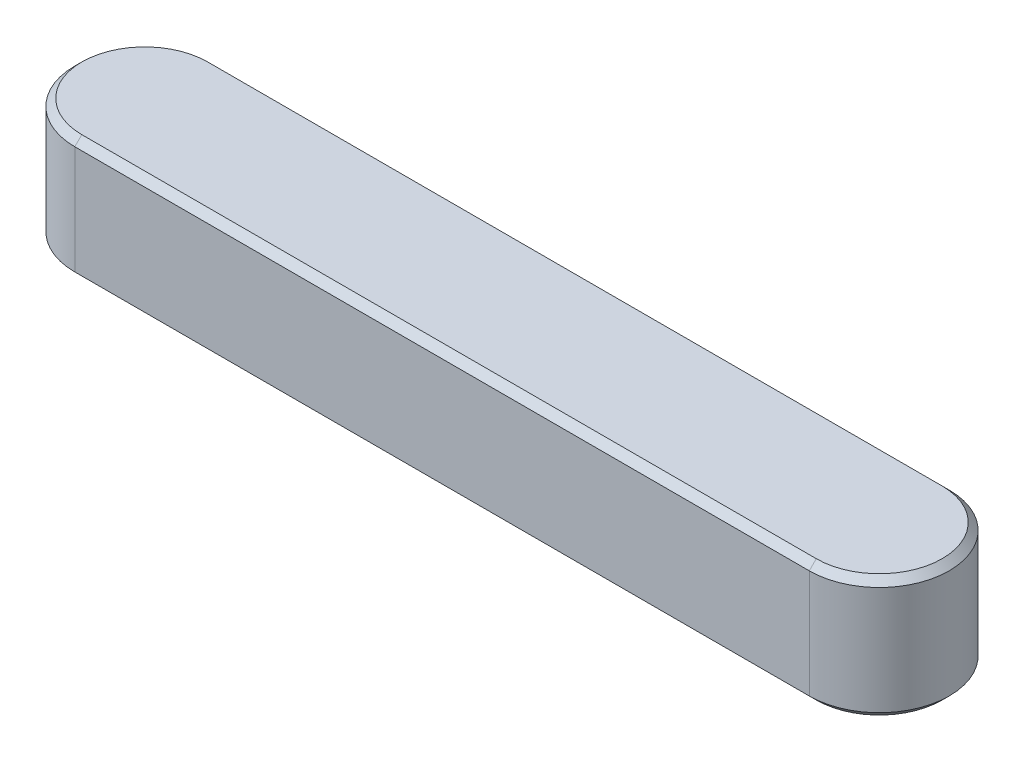
ISO-10303-21;
HEADER;
FILE_DESCRIPTION(('STEP AP214'),'2;1');
FILE_NAME('part.step','',(''),(''),'','','');
FILE_SCHEMA(('AUTOMOTIVE_DESIGN { 1 0 10303 214 1 1 1 1 }'));
ENDSEC;
DATA;
#1=APPLICATION_CONTEXT('core data for automotive mechanical design processes');
#2=APPLICATION_PROTOCOL_DEFINITION('international standard','automotive_design',2000,#1);
#3=PRODUCT_CONTEXT('',#1,'mechanical');
#4=PRODUCT('Part','Part','',(#3));
#5=PRODUCT_RELATED_PRODUCT_CATEGORY('part','',(#4));
#6=PRODUCT_DEFINITION_FORMATION('','',#4);
#7=PRODUCT_DEFINITION_CONTEXT('part definition',#1,'design');
#8=PRODUCT_DEFINITION('design','',#6,#7);
#9=PRODUCT_DEFINITION_SHAPE('','',#8);
#10=(LENGTH_UNIT() NAMED_UNIT(*) SI_UNIT(.MILLI.,.METRE.));
#11=(NAMED_UNIT(*) PLANE_ANGLE_UNIT() SI_UNIT($,.RADIAN.));
#12=(NAMED_UNIT(*) SI_UNIT($,.STERADIAN.) SOLID_ANGLE_UNIT());
#13=UNCERTAINTY_MEASURE_WITH_UNIT(LENGTH_MEASURE(1.E-05),#10,'distance_accuracy_value','');
#14=(GEOMETRIC_REPRESENTATION_CONTEXT(3) GLOBAL_UNCERTAINTY_ASSIGNED_CONTEXT((#13)) GLOBAL_UNIT_ASSIGNED_CONTEXT((#10,
#11,#12)) REPRESENTATION_CONTEXT('',''));
#15=CARTESIAN_POINT('',(0.,0.,0.));
#16=DIRECTION('',(0.,0.,1.));
#17=DIRECTION('',(1.,0.,0.));
#18=AXIS2_PLACEMENT_3D('',#15,#16,#17);
#19=CARTESIAN_POINT('',(46.,6.8,0.));
#20=DIRECTION('',(0.,-1.,0.));
#21=DIRECTION('',(0.,0.,-1.));
#22=AXIS2_PLACEMENT_3D('',#19,#20,#21);
#23=CONICAL_SURFACE('',#22,3.8,0.785398163397448);
#24=DIRECTION('',(0.,0.707106781186548,-0.707106781186547));
#25=VECTOR('',#24,1.);
#26=CARTESIAN_POINT('',(46.,7.,3.6));
#27=LINE('',#26,#25);
#28=CARTESIAN_POINT('',(46.,6.6,4.));
#29=VERTEX_POINT('',#28);
#30=CARTESIAN_POINT('',(46.,7.,3.6));
#31=VERTEX_POINT('',#30);
#32=EDGE_CURVE('E33',#29,#31,#27,.T.);
#33=ORIENTED_EDGE('',*,*,#32,.F.);
#34=CARTESIAN_POINT('',(46.,6.6,0.));
#35=DIRECTION('',(0.,-1.,0.));
#36=DIRECTION('',(0.,0.,-1.));
#37=AXIS2_PLACEMENT_3D('',#34,#35,#36);
#38=CIRCLE('',#37,4.);
#39=CARTESIAN_POINT('',(46.,6.6,-4.));
#40=VERTEX_POINT('',#39);
#41=EDGE_CURVE('E25',#40,#29,#38,.T.);
#42=ORIENTED_EDGE('',*,*,#41,.F.);
#43=DIRECTION('',(0.,-0.707106781186548,-0.707106781186548));
#44=VECTOR('',#43,1.);
#45=CARTESIAN_POINT('',(46.,6.6,-4.));
#46=LINE('',#45,#44);
#47=CARTESIAN_POINT('',(46.,7.,-3.6));
#48=VERTEX_POINT('',#47);
#49=EDGE_CURVE('E129',#48,#40,#46,.T.);
#50=ORIENTED_EDGE('',*,*,#49,.F.);
#51=CARTESIAN_POINT('',(46.,7.,0.));
#52=DIRECTION('',(0.,-1.,0.));
#53=DIRECTION('',(0.,0.,-1.));
#54=AXIS2_PLACEMENT_3D('',#51,#52,#53);
#55=CIRCLE('',#54,3.6);
#56=EDGE_CURVE('E10',#48,#31,#55,.T.);
#57=ORIENTED_EDGE('',*,*,#56,.T.);
#58=EDGE_LOOP('',(#33,#42,#50,#57));
#59=FACE_BOUND('',#58,.T.);
#60=ADVANCED_FACE('F15',(#59),#23,.T.);
#61=CARTESIAN_POINT('',(46.,3.5,0.));
#62=DIRECTION('',(0.,1.,0.));
#63=DIRECTION('',(0.,0.,-1.));
#64=AXIS2_PLACEMENT_3D('',#61,#62,#63);
#65=CYLINDRICAL_SURFACE('',#64,4.);
#66=DIRECTION('',(0.,1.,0.));
#67=VECTOR('',#66,1.);
#68=CARTESIAN_POINT('',(46.,6.6,4.));
#69=LINE('',#68,#67);
#70=CARTESIAN_POINT('',(46.,0.4,4.));
#71=VERTEX_POINT('',#70);
#72=EDGE_CURVE('E70',#71,#29,#69,.T.);
#73=ORIENTED_EDGE('',*,*,#72,.F.);
#74=CARTESIAN_POINT('',(46.,0.4,0.));
#75=DIRECTION('',(0.,-1.,0.));
#76=DIRECTION('',(0.,0.,-1.));
#77=AXIS2_PLACEMENT_3D('',#74,#75,#76);
#78=CIRCLE('',#77,4.);
#79=CARTESIAN_POINT('',(46.,0.4,-4.));
#80=VERTEX_POINT('',#79);
#81=EDGE_CURVE('E151',#80,#71,#78,.T.);
#82=ORIENTED_EDGE('',*,*,#81,.F.);
#83=DIRECTION('',(0.,-1.,0.));
#84=VECTOR('',#83,1.);
#85=CARTESIAN_POINT('',(46.,0.4,-4.));
#86=LINE('',#85,#84);
#87=EDGE_CURVE('E116',#40,#80,#86,.T.);
#88=ORIENTED_EDGE('',*,*,#87,.F.);
#89=ORIENTED_EDGE('',*,*,#41,.T.);
#90=EDGE_LOOP('',(#73,#82,#88,#89));
#91=FACE_BOUND('',#90,.T.);
#92=ADVANCED_FACE('F182',(#91),#65,.T.);
#93=CARTESIAN_POINT('',(46.,0.2,0.));
#94=DIRECTION('',(0.,1.,0.));
#95=DIRECTION('',(0.,0.,-1.));
#96=AXIS2_PLACEMENT_3D('',#93,#94,#95);
#97=CONICAL_SURFACE('',#96,3.8,0.785398163397448);
#98=DIRECTION('',(0.,0.707106781186548,0.707106781186548));
#99=VECTOR('',#98,1.);
#100=CARTESIAN_POINT('',(46.,0.4,4.));
#101=LINE('',#100,#99);
#102=CARTESIAN_POINT('',(46.,0.,3.6));
#103=VERTEX_POINT('',#102);
#104=EDGE_CURVE('E143',#103,#71,#101,.T.);
#105=ORIENTED_EDGE('',*,*,#104,.F.);
#106=CARTESIAN_POINT('',(46.,0.,0.));
#107=DIRECTION('',(0.,-1.,0.));
#108=DIRECTION('',(0.,0.,-1.));
#109=AXIS2_PLACEMENT_3D('',#106,#107,#108);
#110=CIRCLE('',#109,3.6);
#111=CARTESIAN_POINT('',(46.,0.,-3.6));
#112=VERTEX_POINT('',#111);
#113=EDGE_CURVE('E84',#112,#103,#110,.T.);
#114=ORIENTED_EDGE('',*,*,#113,.F.);
#115=DIRECTION('',(0.,-0.707106781186547,0.707106781186548));
#116=VECTOR('',#115,1.);
#117=CARTESIAN_POINT('',(46.,0.,-3.6));
#118=LINE('',#117,#116);
#119=EDGE_CURVE('E77',#80,#112,#118,.T.);
#120=ORIENTED_EDGE('',*,*,#119,.F.);
#121=ORIENTED_EDGE('',*,*,#81,.T.);
#122=EDGE_LOOP('',(#105,#114,#120,#121));
#123=FACE_BOUND('',#122,.T.);
#124=ADVANCED_FACE('F183',(#123),#97,.T.);
#125=CARTESIAN_POINT('',(4.,0.2,0.));
#126=DIRECTION('',(0.,1.,0.));
#127=DIRECTION('',(0.,0.,-1.));
#128=AXIS2_PLACEMENT_3D('',#125,#126,#127);
#129=CONICAL_SURFACE('',#128,3.8,0.785398163397448);
#130=DIRECTION('',(0.,-0.707106781186548,-0.707106781186548));
#131=VECTOR('',#130,1.);
#132=CARTESIAN_POINT('',(4.,0.4,4.));
#133=LINE('',#132,#131);
#134=CARTESIAN_POINT('',(4.,0.4,4.));
#135=VERTEX_POINT('',#134);
#136=CARTESIAN_POINT('',(4.,0.,3.6));
#137=VERTEX_POINT('',#136);
#138=EDGE_CURVE('E122',#135,#137,#133,.T.);
#139=ORIENTED_EDGE('',*,*,#138,.F.);
#140=CARTESIAN_POINT('',(4.,0.4,0.));
#141=DIRECTION('',(0.,1.,0.));
#142=DIRECTION('',(0.,0.,-1.));
#143=AXIS2_PLACEMENT_3D('',#140,#141,#142);
#144=CIRCLE('',#143,4.);
#145=CARTESIAN_POINT('',(4.,0.4,-4.));
#146=VERTEX_POINT('',#145);
#147=EDGE_CURVE('E108',#146,#135,#144,.T.);
#148=ORIENTED_EDGE('',*,*,#147,.F.);
#149=DIRECTION('',(0.,0.707106781186547,-0.707106781186548));
#150=VECTOR('',#149,1.);
#151=CARTESIAN_POINT('',(4.,0.,-3.6));
#152=LINE('',#151,#150);
#153=CARTESIAN_POINT('',(4.,0.,-3.6));
#154=VERTEX_POINT('',#153);
#155=EDGE_CURVE('E92',#154,#146,#152,.T.);
#156=ORIENTED_EDGE('',*,*,#155,.F.);
#157=CARTESIAN_POINT('',(4.,0.,0.));
#158=DIRECTION('',(0.,1.,0.));
#159=DIRECTION('',(0.,0.,-1.));
#160=AXIS2_PLACEMENT_3D('',#157,#158,#159);
#161=CIRCLE('',#160,3.6);
#162=EDGE_CURVE('E123',#154,#137,#161,.T.);
#163=ORIENTED_EDGE('',*,*,#162,.T.);
#164=EDGE_LOOP('',(#139,#148,#156,#163));
#165=FACE_BOUND('',#164,.T.);
#166=ADVANCED_FACE('F120',(#165),#129,.T.);
#167=CARTESIAN_POINT('',(4.,3.5,0.));
#168=DIRECTION('',(0.,-1.,0.));
#169=DIRECTION('',(0.,0.,-1.));
#170=AXIS2_PLACEMENT_3D('',#167,#168,#169);
#171=CYLINDRICAL_SURFACE('',#170,4.);
#172=DIRECTION('',(0.,-1.,0.));
#173=VECTOR('',#172,1.);
#174=CARTESIAN_POINT('',(4.,6.6,4.));
#175=LINE('',#174,#173);
#176=CARTESIAN_POINT('',(4.,6.6,4.));
#177=VERTEX_POINT('',#176);
#178=EDGE_CURVE('E147',#177,#135,#175,.T.);
#179=ORIENTED_EDGE('',*,*,#178,.F.);
#180=CARTESIAN_POINT('',(4.,6.6,0.));
#181=DIRECTION('',(0.,1.,0.));
#182=DIRECTION('',(0.,0.,-1.));
#183=AXIS2_PLACEMENT_3D('',#180,#181,#182);
#184=CIRCLE('',#183,4.);
#185=CARTESIAN_POINT('',(4.,6.6,-4.));
#186=VERTEX_POINT('',#185);
#187=EDGE_CURVE('E111',#186,#177,#184,.T.);
#188=ORIENTED_EDGE('',*,*,#187,.F.);
#189=DIRECTION('',(0.,1.,0.));
#190=VECTOR('',#189,1.);
#191=CARTESIAN_POINT('',(4.,0.4,-4.));
#192=LINE('',#191,#190);
#193=EDGE_CURVE('E105',#146,#186,#192,.T.);
#194=ORIENTED_EDGE('',*,*,#193,.F.);
#195=ORIENTED_EDGE('',*,*,#147,.T.);
#196=EDGE_LOOP('',(#179,#188,#194,#195));
#197=FACE_BOUND('',#196,.T.);
#198=ADVANCED_FACE('F107',(#197),#171,.T.);
#199=CARTESIAN_POINT('',(4.,6.8,0.));
#200=DIRECTION('',(0.,-1.,0.));
#201=DIRECTION('',(0.,0.,-1.));
#202=AXIS2_PLACEMENT_3D('',#199,#200,#201);
#203=CONICAL_SURFACE('',#202,3.8,0.785398163397448);
#204=DIRECTION('',(0.,-0.707106781186548,0.707106781186547));
#205=VECTOR('',#204,1.);
#206=CARTESIAN_POINT('',(4.,7.,3.6));
#207=LINE('',#206,#205);
#208=CARTESIAN_POINT('',(4.,7.,3.6));
#209=VERTEX_POINT('',#208);
#210=EDGE_CURVE('E146',#209,#177,#207,.T.);
#211=ORIENTED_EDGE('',*,*,#210,.F.);
#212=CARTESIAN_POINT('',(4.,7.,0.));
#213=DIRECTION('',(0.,1.,0.));
#214=DIRECTION('',(0.,0.,-1.));
#215=AXIS2_PLACEMENT_3D('',#212,#213,#214);
#216=CIRCLE('',#215,3.6);
#217=CARTESIAN_POINT('',(4.,7.,-3.6));
#218=VERTEX_POINT('',#217);
#219=EDGE_CURVE('E19',#218,#209,#216,.T.);
#220=ORIENTED_EDGE('',*,*,#219,.F.);
#221=DIRECTION('',(0.,0.707106781186548,0.707106781186548));
#222=VECTOR('',#221,1.);
#223=CARTESIAN_POINT('',(4.,6.6,-4.));
#224=LINE('',#223,#222);
#225=EDGE_CURVE('E140',#186,#218,#224,.T.);
#226=ORIENTED_EDGE('',*,*,#225,.F.);
#227=ORIENTED_EDGE('',*,*,#187,.T.);
#228=EDGE_LOOP('',(#211,#220,#226,#227));
#229=FACE_BOUND('',#228,.T.);
#230=ADVANCED_FACE('F176',(#229),#203,.T.);
#231=CARTESIAN_POINT('',(4.,0.2,3.8));
#232=DIRECTION('',(0.,-0.707106781186548,0.707106781186548));
#233=DIRECTION('',(0.,-0.707106781186548,-0.707106781186548));
#234=AXIS2_PLACEMENT_3D('',#231,#232,#233);
#235=PLANE('',#234);
#236=ORIENTED_EDGE('',*,*,#104,.T.);
#237=DIRECTION('',(1.,0.,0.));
#238=VECTOR('',#237,1.);
#239=CARTESIAN_POINT('',(4.,0.4,4.));
#240=LINE('',#239,#238);
#241=EDGE_CURVE('E145',#135,#71,#240,.T.);
#242=ORIENTED_EDGE('',*,*,#241,.F.);
#243=ORIENTED_EDGE('',*,*,#138,.T.);
#244=DIRECTION('',(1.,0.,0.));
#245=VECTOR('',#244,1.);
#246=CARTESIAN_POINT('',(4.,0.,3.6));
#247=LINE('',#246,#245);
#248=EDGE_CURVE('E135',#137,#103,#247,.T.);
#249=ORIENTED_EDGE('',*,*,#248,.T.);
#250=EDGE_LOOP('',(#236,#242,#243,#249));
#251=FACE_BOUND('',#250,.T.);
#252=ADVANCED_FACE('F171',(#251),#235,.T.);
#253=CARTESIAN_POINT('',(4.,3.5,4.));
#254=DIRECTION('',(0.,0.,1.));
#255=DIRECTION('',(0.,-1.,0.));
#256=AXIS2_PLACEMENT_3D('',#253,#254,#255);
#257=PLANE('',#256);
#258=ORIENTED_EDGE('',*,*,#72,.T.);
#259=DIRECTION('',(1.,0.,0.));
#260=VECTOR('',#259,1.);
#261=CARTESIAN_POINT('',(4.,6.6,4.));
#262=LINE('',#261,#260);
#263=EDGE_CURVE('E157',#177,#29,#262,.T.);
#264=ORIENTED_EDGE('',*,*,#263,.F.);
#265=ORIENTED_EDGE('',*,*,#178,.T.);
#266=ORIENTED_EDGE('',*,*,#241,.T.);
#267=EDGE_LOOP('',(#258,#264,#265,#266));
#268=FACE_BOUND('',#267,.T.);
#269=ADVANCED_FACE('F173',(#268),#257,.T.);
#270=CARTESIAN_POINT('',(4.,6.8,3.8));
#271=DIRECTION('',(0.,0.707106781186547,0.707106781186548));
#272=DIRECTION('',(0.,-0.707106781186548,0.707106781186547));
#273=AXIS2_PLACEMENT_3D('',#270,#271,#272);
#274=PLANE('',#273);
#275=ORIENTED_EDGE('',*,*,#32,.T.);
#276=DIRECTION('',(1.,0.,0.));
#277=VECTOR('',#276,1.);
#278=CARTESIAN_POINT('',(4.,7.,3.6));
#279=LINE('',#278,#277);
#280=EDGE_CURVE('E159',#209,#31,#279,.T.);
#281=ORIENTED_EDGE('',*,*,#280,.F.);
#282=ORIENTED_EDGE('',*,*,#210,.T.);
#283=ORIENTED_EDGE('',*,*,#263,.T.);
#284=EDGE_LOOP('',(#275,#281,#282,#283));
#285=FACE_BOUND('',#284,.T.);
#286=ADVANCED_FACE('F200',(#285),#274,.T.);
#287=CARTESIAN_POINT('',(4.,7.,0.));
#288=DIRECTION('',(0.,1.,0.));
#289=DIRECTION('',(0.,0.,1.));
#290=AXIS2_PLACEMENT_3D('',#287,#288,#289);
#291=PLANE('',#290);
#292=ORIENTED_EDGE('',*,*,#280,.T.);
#293=ORIENTED_EDGE('',*,*,#56,.F.);
#294=DIRECTION('',(1.,0.,0.));
#295=VECTOR('',#294,1.);
#296=CARTESIAN_POINT('',(4.,7.,-3.6));
#297=LINE('',#296,#295);
#298=EDGE_CURVE('E138',#218,#48,#297,.T.);
#299=ORIENTED_EDGE('',*,*,#298,.F.);
#300=ORIENTED_EDGE('',*,*,#219,.T.);
#301=EDGE_LOOP('',(#292,#293,#299,#300));
#302=FACE_BOUND('',#301,.T.);
#303=ADVANCED_FACE('F205',(#302),#291,.T.);
#304=CARTESIAN_POINT('',(4.,6.8,-3.8));
#305=DIRECTION('',(0.,0.707106781186548,-0.707106781186548));
#306=DIRECTION('',(0.,0.707106781186548,0.707106781186548));
#307=AXIS2_PLACEMENT_3D('',#304,#305,#306);
#308=PLANE('',#307);
#309=ORIENTED_EDGE('',*,*,#49,.T.);
#310=DIRECTION('',(1.,0.,0.));
#311=VECTOR('',#310,1.);
#312=CARTESIAN_POINT('',(4.,6.6,-4.));
#313=LINE('',#312,#311);
#314=EDGE_CURVE('E117',#186,#40,#313,.T.);
#315=ORIENTED_EDGE('',*,*,#314,.F.);
#316=ORIENTED_EDGE('',*,*,#225,.T.);
#317=ORIENTED_EDGE('',*,*,#298,.T.);
#318=EDGE_LOOP('',(#309,#315,#316,#317));
#319=FACE_BOUND('',#318,.T.);
#320=ADVANCED_FACE('F181',(#319),#308,.T.);
#321=CARTESIAN_POINT('',(4.,3.5,-4.));
#322=DIRECTION('',(0.,0.,-1.));
#323=DIRECTION('',(0.,1.,0.));
#324=AXIS2_PLACEMENT_3D('',#321,#322,#323);
#325=PLANE('',#324);
#326=ORIENTED_EDGE('',*,*,#87,.T.);
#327=DIRECTION('',(1.,0.,0.));
#328=VECTOR('',#327,1.);
#329=CARTESIAN_POINT('',(4.,0.4,-4.));
#330=LINE('',#329,#328);
#331=EDGE_CURVE('E95',#146,#80,#330,.T.);
#332=ORIENTED_EDGE('',*,*,#331,.F.);
#333=ORIENTED_EDGE('',*,*,#193,.T.);
#334=ORIENTED_EDGE('',*,*,#314,.T.);
#335=EDGE_LOOP('',(#326,#332,#333,#334));
#336=FACE_BOUND('',#335,.T.);
#337=ADVANCED_FACE('F125',(#336),#325,.T.);
#338=CARTESIAN_POINT('',(4.,0.2,-3.8));
#339=DIRECTION('',(0.,-0.707106781186548,-0.707106781186547));
#340=DIRECTION('',(0.,0.707106781186547,-0.707106781186548));
#341=AXIS2_PLACEMENT_3D('',#338,#339,#340);
#342=PLANE('',#341);
#343=ORIENTED_EDGE('',*,*,#119,.T.);
#344=DIRECTION('',(1.,0.,0.));
#345=VECTOR('',#344,1.);
#346=CARTESIAN_POINT('',(4.,0.,-3.6));
#347=LINE('',#346,#345);
#348=EDGE_CURVE('E96',#154,#112,#347,.T.);
#349=ORIENTED_EDGE('',*,*,#348,.F.);
#350=ORIENTED_EDGE('',*,*,#155,.T.);
#351=ORIENTED_EDGE('',*,*,#331,.T.);
#352=EDGE_LOOP('',(#343,#349,#350,#351));
#353=FACE_BOUND('',#352,.T.);
#354=ADVANCED_FACE('F17',(#353),#342,.T.);
#355=CARTESIAN_POINT('',(4.,0.,0.));
#356=DIRECTION('',(0.,-1.,0.));
#357=DIRECTION('',(0.,0.,-1.));
#358=AXIS2_PLACEMENT_3D('',#355,#356,#357);
#359=PLANE('',#358);
#360=ORIENTED_EDGE('',*,*,#348,.T.);
#361=ORIENTED_EDGE('',*,*,#113,.T.);
#362=ORIENTED_EDGE('',*,*,#248,.F.);
#363=ORIENTED_EDGE('',*,*,#162,.F.);
#364=EDGE_LOOP('',(#360,#361,#362,#363));
#365=FACE_BOUND('',#364,.T.);
#366=ADVANCED_FACE('F169',(#365),#359,.T.);
#367=CLOSED_SHELL('',(#60,#92,#124,#166,#198,#230,#252,#269,#286,#303,#320,#337,#354,#366));
#368=MANIFOLD_SOLID_BREP('B1',#367);
#369=ADVANCED_BREP_SHAPE_REPRESENTATION('',(#18,#368),#14);
#370=SHAPE_DEFINITION_REPRESENTATION(#9,#369);
ENDSEC;
END-ISO-10303-21;
